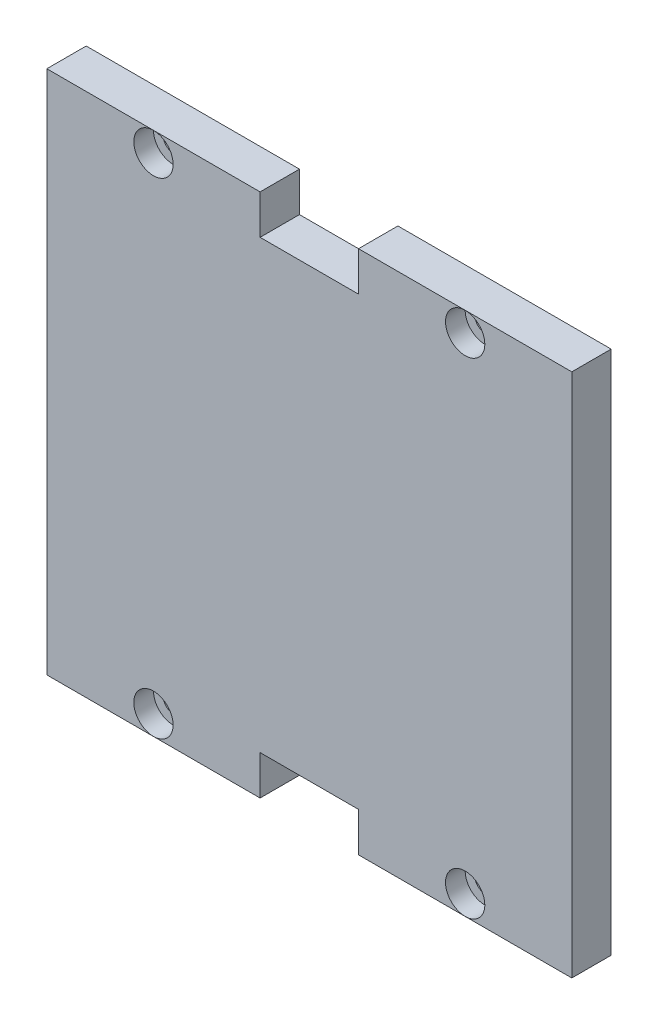
ISO-10303-21;
HEADER;
FILE_DESCRIPTION(('STEP AP214'),'2;1');
FILE_NAME('part.step','',(''),(''),'','','');
FILE_SCHEMA(('AUTOMOTIVE_DESIGN { 1 0 10303 214 1 1 1 1 }'));
ENDSEC;
DATA;
#1=APPLICATION_CONTEXT('core data for automotive mechanical design processes');
#2=APPLICATION_PROTOCOL_DEFINITION('international standard','automotive_design',2000,#1);
#3=PRODUCT_CONTEXT('',#1,'mechanical');
#4=PRODUCT('Part','Part','',(#3));
#5=PRODUCT_RELATED_PRODUCT_CATEGORY('part','',(#4));
#6=PRODUCT_DEFINITION_FORMATION('','',#4);
#7=PRODUCT_DEFINITION_CONTEXT('part definition',#1,'design');
#8=PRODUCT_DEFINITION('design','',#6,#7);
#9=PRODUCT_DEFINITION_SHAPE('','',#8);
#10=(LENGTH_UNIT() NAMED_UNIT(*) SI_UNIT(.MILLI.,.METRE.));
#11=(NAMED_UNIT(*) PLANE_ANGLE_UNIT() SI_UNIT($,.RADIAN.));
#12=(NAMED_UNIT(*) SI_UNIT($,.STERADIAN.) SOLID_ANGLE_UNIT());
#13=UNCERTAINTY_MEASURE_WITH_UNIT(LENGTH_MEASURE(1.E-05),#10,'distance_accuracy_value','');
#14=(GEOMETRIC_REPRESENTATION_CONTEXT(3) GLOBAL_UNCERTAINTY_ASSIGNED_CONTEXT((#13)) GLOBAL_UNIT_ASSIGNED_CONTEXT((#10,
#11,#12)) REPRESENTATION_CONTEXT('',''));
#15=CARTESIAN_POINT('',(0.,0.,0.));
#16=DIRECTION('',(0.,0.,1.));
#17=DIRECTION('',(1.,0.,0.));
#18=AXIS2_PLACEMENT_3D('',#15,#16,#17);
#19=CARTESIAN_POINT('',(-63.75,77.,0.));
#20=DIRECTION('',(0.,0.,1.));
#21=DIRECTION('',(1.,0.,0.));
#22=AXIS2_PLACEMENT_3D('',#19,#20,#21);
#23=CYLINDRICAL_SURFACE('',#22,1.5);
#24=CARTESIAN_POINT('',(-63.75,77.,0.));
#25=DIRECTION('',(0.,0.,1.));
#26=DIRECTION('',(-1.,0.,0.));
#27=AXIS2_PLACEMENT_3D('',#24,#25,#26);
#28=CIRCLE('',#27,1.5);
#29=CARTESIAN_POINT('',(-65.25,77.,0.));
#30=VERTEX_POINT('',#29);
#31=EDGE_CURVE('E259',#30,#30,#28,.T.);
#32=ORIENTED_EDGE('',*,*,#31,.F.);
#33=EDGE_LOOP('',(#32));
#34=FACE_BOUND('',#33,.T.);
#35=CARTESIAN_POINT('',(-63.75,77.,3.));
#36=DIRECTION('',(0.,0.,1.));
#37=DIRECTION('',(1.,0.,0.));
#38=AXIS2_PLACEMENT_3D('',#35,#36,#37);
#39=CIRCLE('',#38,1.5);
#40=CARTESIAN_POINT('',(-62.25,77.,3.));
#41=VERTEX_POINT('',#40);
#42=EDGE_CURVE('E39',#41,#41,#39,.F.);
#43=ORIENTED_EDGE('',*,*,#42,.F.);
#44=EDGE_LOOP('',(#43));
#45=FACE_BOUND('',#44,.T.);
#46=ADVANCED_FACE('F35',(#34,#45),#23,.F.);
#47=CARTESIAN_POINT('',(-16.25,77.,0.));
#48=DIRECTION('',(0.,0.,1.));
#49=DIRECTION('',(1.,0.,0.));
#50=AXIS2_PLACEMENT_3D('',#47,#48,#49);
#51=CYLINDRICAL_SURFACE('',#50,1.50000000000001);
#52=CARTESIAN_POINT('',(-16.25,77.,0.));
#53=DIRECTION('',(0.,0.,1.));
#54=DIRECTION('',(-1.,0.,0.));
#55=AXIS2_PLACEMENT_3D('',#52,#53,#54);
#56=CIRCLE('',#55,1.50000000000001);
#57=CARTESIAN_POINT('',(-17.75,77.,0.));
#58=VERTEX_POINT('',#57);
#59=EDGE_CURVE('E224',#58,#58,#56,.T.);
#60=ORIENTED_EDGE('',*,*,#59,.F.);
#61=EDGE_LOOP('',(#60));
#62=FACE_BOUND('',#61,.T.);
#63=CARTESIAN_POINT('',(-16.25,77.,3.));
#64=DIRECTION('',(0.,0.,1.));
#65=DIRECTION('',(1.,0.,0.));
#66=AXIS2_PLACEMENT_3D('',#63,#64,#65);
#67=CIRCLE('',#66,1.50000000000001);
#68=CARTESIAN_POINT('',(-14.75,77.,3.));
#69=VERTEX_POINT('',#68);
#70=EDGE_CURVE('E230',#69,#69,#67,.F.);
#71=ORIENTED_EDGE('',*,*,#70,.F.);
#72=EDGE_LOOP('',(#71));
#73=FACE_BOUND('',#72,.T.);
#74=ADVANCED_FACE('F292',(#62,#73),#51,.F.);
#75=CARTESIAN_POINT('',(-63.75,2.99999999999999,0.));
#76=DIRECTION('',(0.,0.,1.));
#77=DIRECTION('',(1.,0.,0.));
#78=AXIS2_PLACEMENT_3D('',#75,#76,#77);
#79=CYLINDRICAL_SURFACE('',#78,1.5);
#80=CARTESIAN_POINT('',(-63.75,2.99999999999999,0.));
#81=DIRECTION('',(0.,0.,1.));
#82=DIRECTION('',(1.,0.,0.));
#83=AXIS2_PLACEMENT_3D('',#80,#81,#82);
#84=CIRCLE('',#83,1.5);
#85=CARTESIAN_POINT('',(-62.25,2.99999999999999,0.));
#86=VERTEX_POINT('',#85);
#87=EDGE_CURVE('E257',#86,#86,#84,.T.);
#88=ORIENTED_EDGE('',*,*,#87,.F.);
#89=EDGE_LOOP('',(#88));
#90=FACE_BOUND('',#89,.T.);
#91=CARTESIAN_POINT('',(-63.75,2.99999999999999,3.));
#92=DIRECTION('',(0.,0.,1.));
#93=DIRECTION('',(1.,0.,0.));
#94=AXIS2_PLACEMENT_3D('',#91,#92,#93);
#95=CIRCLE('',#94,1.5);
#96=CARTESIAN_POINT('',(-62.25,2.99999999999999,3.));
#97=VERTEX_POINT('',#96);
#98=EDGE_CURVE('E226',#97,#97,#95,.F.);
#99=ORIENTED_EDGE('',*,*,#98,.F.);
#100=EDGE_LOOP('',(#99));
#101=FACE_BOUND('',#100,.T.);
#102=ADVANCED_FACE('F271',(#90,#101),#79,.F.);
#103=CARTESIAN_POINT('',(-16.25,2.99999999999998,0.));
#104=DIRECTION('',(0.,0.,1.));
#105=DIRECTION('',(1.,0.,0.));
#106=AXIS2_PLACEMENT_3D('',#103,#104,#105);
#107=CYLINDRICAL_SURFACE('',#106,1.5);
#108=CARTESIAN_POINT('',(-16.25,2.99999999999998,0.));
#109=DIRECTION('',(0.,0.,1.));
#110=DIRECTION('',(1.,0.,0.));
#111=AXIS2_PLACEMENT_3D('',#108,#109,#110);
#112=CIRCLE('',#111,1.5);
#113=CARTESIAN_POINT('',(-14.75,2.99999999999998,0.));
#114=VERTEX_POINT('',#113);
#115=EDGE_CURVE('E152',#114,#114,#112,.T.);
#116=ORIENTED_EDGE('',*,*,#115,.F.);
#117=EDGE_LOOP('',(#116));
#118=FACE_BOUND('',#117,.T.);
#119=CARTESIAN_POINT('',(-16.25,2.99999999999998,3.));
#120=DIRECTION('',(0.,0.,1.));
#121=DIRECTION('',(1.,0.,0.));
#122=AXIS2_PLACEMENT_3D('',#119,#120,#121);
#123=CIRCLE('',#122,1.5);
#124=CARTESIAN_POINT('',(-14.75,2.99999999999998,3.));
#125=VERTEX_POINT('',#124);
#126=EDGE_CURVE('E221',#125,#125,#123,.F.);
#127=ORIENTED_EDGE('',*,*,#126,.F.);
#128=EDGE_LOOP('',(#127));
#129=FACE_BOUND('',#128,.T.);
#130=ADVANCED_FACE('F267',(#118,#129),#107,.F.);
#131=CARTESIAN_POINT('',(0.,80.,6.));
#132=DIRECTION('',(0.,-1.,0.));
#133=DIRECTION('',(1.,0.,0.));
#134=AXIS2_PLACEMENT_3D('',#131,#132,#133);
#135=PLANE('',#134);
#136=DIRECTION('',(-1.,0.,0.));
#137=VECTOR('',#136,1.);
#138=CARTESIAN_POINT('',(0.,80.,6.));
#139=LINE('',#138,#137);
#140=CARTESIAN_POINT('',(-47.5,80.,6.));
#141=VERTEX_POINT('',#140);
#142=CARTESIAN_POINT('',(-80.,80.,6.));
#143=VERTEX_POINT('',#142);
#144=EDGE_CURVE('E192',#141,#143,#139,.T.);
#145=ORIENTED_EDGE('',*,*,#144,.F.);
#146=DIRECTION('',(0.,0.,1.));
#147=VECTOR('',#146,1.);
#148=CARTESIAN_POINT('',(-47.5,80.,0.));
#149=LINE('',#148,#147);
#150=CARTESIAN_POINT('',(-47.5,80.,0.));
#151=VERTEX_POINT('',#150);
#152=EDGE_CURVE('E158',#151,#141,#149,.T.);
#153=ORIENTED_EDGE('',*,*,#152,.F.);
#154=DIRECTION('',(-1.,0.,0.));
#155=VECTOR('',#154,1.);
#156=CARTESIAN_POINT('',(0.,80.,0.));
#157=LINE('',#156,#155);
#158=CARTESIAN_POINT('',(-80.,80.,0.));
#159=VERTEX_POINT('',#158);
#160=EDGE_CURVE('E146',#151,#159,#157,.T.);
#161=ORIENTED_EDGE('',*,*,#160,.T.);
#162=DIRECTION('',(0.,0.,-1.));
#163=VECTOR('',#162,1.);
#164=CARTESIAN_POINT('',(-80.,80.,6.));
#165=LINE('',#164,#163);
#166=EDGE_CURVE('E44',#143,#159,#165,.T.);
#167=ORIENTED_EDGE('',*,*,#166,.F.);
#168=EDGE_LOOP('',(#145,#153,#161,#167));
#169=FACE_BOUND('',#168,.T.);
#170=ADVANCED_FACE('F270',(#169),#135,.F.);
#171=CARTESIAN_POINT('',(0.,0.,6.));
#172=DIRECTION('',(0.,1.,0.));
#173=DIRECTION('',(-1.,0.,0.));
#174=AXIS2_PLACEMENT_3D('',#171,#172,#173);
#175=PLANE('',#174);
#176=DIRECTION('',(1.,0.,0.));
#177=VECTOR('',#176,1.);
#178=CARTESIAN_POINT('',(0.,0.,0.));
#179=LINE('',#178,#177);
#180=CARTESIAN_POINT('',(-80.,0.,0.));
#181=VERTEX_POINT('',#180);
#182=CARTESIAN_POINT('',(-47.5,0.,0.));
#183=VERTEX_POINT('',#182);
#184=EDGE_CURVE('E193',#181,#183,#179,.T.);
#185=ORIENTED_EDGE('',*,*,#184,.T.);
#186=DIRECTION('',(0.,0.,1.));
#187=VECTOR('',#186,1.);
#188=CARTESIAN_POINT('',(-47.5,0.,0.));
#189=LINE('',#188,#187);
#190=CARTESIAN_POINT('',(-47.5,0.,6.));
#191=VERTEX_POINT('',#190);
#192=EDGE_CURVE('E173',#183,#191,#189,.T.);
#193=ORIENTED_EDGE('',*,*,#192,.T.);
#194=DIRECTION('',(1.,0.,0.));
#195=VECTOR('',#194,1.);
#196=CARTESIAN_POINT('',(0.,0.,6.));
#197=LINE('',#196,#195);
#198=CARTESIAN_POINT('',(-80.,0.,6.));
#199=VERTEX_POINT('',#198);
#200=EDGE_CURVE('E200',#199,#191,#197,.T.);
#201=ORIENTED_EDGE('',*,*,#200,.F.);
#202=DIRECTION('',(0.,0.,-1.));
#203=VECTOR('',#202,1.);
#204=CARTESIAN_POINT('',(-80.,0.,6.));
#205=LINE('',#204,#203);
#206=EDGE_CURVE('E216',#199,#181,#205,.T.);
#207=ORIENTED_EDGE('',*,*,#206,.T.);
#208=EDGE_LOOP('',(#185,#193,#201,#207));
#209=FACE_BOUND('',#208,.T.);
#210=ADVANCED_FACE('F331',(#209),#175,.F.);
#211=CARTESIAN_POINT('',(0.,0.,6.));
#212=DIRECTION('',(-1.,0.,0.));
#213=DIRECTION('',(0.,0.,1.));
#214=AXIS2_PLACEMENT_3D('',#211,#212,#213);
#215=PLANE('',#214);
#216=DIRECTION('',(0.,1.,0.));
#217=VECTOR('',#216,1.);
#218=CARTESIAN_POINT('',(0.,0.,0.));
#219=LINE('',#218,#217);
#220=CARTESIAN_POINT('',(0.,0.,0.));
#221=VERTEX_POINT('',#220);
#222=CARTESIAN_POINT('',(0.,80.,0.));
#223=VERTEX_POINT('',#222);
#224=EDGE_CURVE('E182',#221,#223,#219,.T.);
#225=ORIENTED_EDGE('',*,*,#224,.T.);
#226=DIRECTION('',(0.,0.,-1.));
#227=VECTOR('',#226,1.);
#228=CARTESIAN_POINT('',(0.,80.,6.));
#229=LINE('',#228,#227);
#230=CARTESIAN_POINT('',(0.,80.,6.));
#231=VERTEX_POINT('',#230);
#232=EDGE_CURVE('E11',#231,#223,#229,.T.);
#233=ORIENTED_EDGE('',*,*,#232,.F.);
#234=DIRECTION('',(0.,1.,0.));
#235=VECTOR('',#234,1.);
#236=CARTESIAN_POINT('',(0.,0.,6.));
#237=LINE('',#236,#235);
#238=CARTESIAN_POINT('',(0.,0.,6.));
#239=VERTEX_POINT('',#238);
#240=EDGE_CURVE('E189',#239,#231,#237,.T.);
#241=ORIENTED_EDGE('',*,*,#240,.F.);
#242=DIRECTION('',(0.,0.,-1.));
#243=VECTOR('',#242,1.);
#244=CARTESIAN_POINT('',(0.,0.,6.));
#245=LINE('',#244,#243);
#246=EDGE_CURVE('E203',#239,#221,#245,.T.);
#247=ORIENTED_EDGE('',*,*,#246,.T.);
#248=EDGE_LOOP('',(#225,#233,#241,#247));
#249=FACE_BOUND('',#248,.T.);
#250=ADVANCED_FACE('F37',(#249),#215,.F.);
#251=CARTESIAN_POINT('',(-32.5,80.,0.));
#252=VERTEX_POINT('',#251);
#253=EDGE_CURVE('E206',#223,#252,#157,.T.);
#254=ORIENTED_EDGE('',*,*,#253,.T.);
#255=DIRECTION('',(0.,0.,1.));
#256=VECTOR('',#255,1.);
#257=CARTESIAN_POINT('',(-32.5,80.,0.));
#258=LINE('',#257,#256);
#259=CARTESIAN_POINT('',(-32.5,80.,6.));
#260=VERTEX_POINT('',#259);
#261=EDGE_CURVE('E161',#252,#260,#258,.T.);
#262=ORIENTED_EDGE('',*,*,#261,.T.);
#263=EDGE_CURVE('E194',#231,#260,#139,.T.);
#264=ORIENTED_EDGE('',*,*,#263,.F.);
#265=ORIENTED_EDGE('',*,*,#232,.T.);
#266=EDGE_LOOP('',(#254,#262,#264,#265));
#267=FACE_BOUND('',#266,.T.);
#268=ADVANCED_FACE('F333',(#267),#135,.F.);
#269=CARTESIAN_POINT('',(-80.,0.,6.));
#270=DIRECTION('',(1.,0.,0.));
#271=DIRECTION('',(0.,0.,-1.));
#272=AXIS2_PLACEMENT_3D('',#269,#270,#271);
#273=PLANE('',#272);
#274=DIRECTION('',(0.,-1.,0.));
#275=VECTOR('',#274,1.);
#276=CARTESIAN_POINT('',(-80.,0.,0.));
#277=LINE('',#276,#275);
#278=EDGE_CURVE('E209',#159,#181,#277,.T.);
#279=ORIENTED_EDGE('',*,*,#278,.T.);
#280=ORIENTED_EDGE('',*,*,#206,.F.);
#281=DIRECTION('',(0.,-1.,0.));
#282=VECTOR('',#281,1.);
#283=CARTESIAN_POINT('',(-80.,0.,6.));
#284=LINE('',#283,#282);
#285=EDGE_CURVE('E197',#143,#199,#284,.T.);
#286=ORIENTED_EDGE('',*,*,#285,.F.);
#287=ORIENTED_EDGE('',*,*,#166,.T.);
#288=EDGE_LOOP('',(#279,#280,#286,#287));
#289=FACE_BOUND('',#288,.T.);
#290=ADVANCED_FACE('F329',(#289),#273,.F.);
#291=CARTESIAN_POINT('',(-32.5,0.,6.));
#292=VERTEX_POINT('',#291);
#293=EDGE_CURVE('E199',#292,#239,#197,.T.);
#294=ORIENTED_EDGE('',*,*,#293,.F.);
#295=DIRECTION('',(0.,0.,1.));
#296=VECTOR('',#295,1.);
#297=CARTESIAN_POINT('',(-32.5,0.,0.));
#298=LINE('',#297,#296);
#299=CARTESIAN_POINT('',(-32.5,0.,0.));
#300=VERTEX_POINT('',#299);
#301=EDGE_CURVE('E185',#300,#292,#298,.T.);
#302=ORIENTED_EDGE('',*,*,#301,.F.);
#303=EDGE_CURVE('E211',#300,#221,#179,.T.);
#304=ORIENTED_EDGE('',*,*,#303,.T.);
#305=ORIENTED_EDGE('',*,*,#246,.F.);
#306=EDGE_LOOP('',(#294,#302,#304,#305));
#307=FACE_BOUND('',#306,.T.);
#308=ADVANCED_FACE('F322',(#307),#175,.F.);
#309=CARTESIAN_POINT('',(0.,0.,6.));
#310=DIRECTION('',(0.,0.,1.));
#311=DIRECTION('',(1.,0.,0.));
#312=AXIS2_PLACEMENT_3D('',#309,#310,#311);
#313=PLANE('',#312);
#314=CARTESIAN_POINT('',(-63.75,77.,6.));
#315=DIRECTION('',(0.,0.,1.));
#316=DIRECTION('',(1.,0.,0.));
#317=AXIS2_PLACEMENT_3D('',#314,#315,#316);
#318=CIRCLE('',#317,2.99499999999999);
#319=CARTESIAN_POINT('',(-60.755,77.,6.));
#320=VERTEX_POINT('',#319);
#321=EDGE_CURVE('E246',#320,#320,#318,.T.);
#322=ORIENTED_EDGE('',*,*,#321,.F.);
#323=EDGE_LOOP('',(#322));
#324=FACE_BOUND('',#323,.T.);
#325=CARTESIAN_POINT('',(-16.25,77.,6.));
#326=DIRECTION('',(0.,0.,1.));
#327=DIRECTION('',(1.,0.,0.));
#328=AXIS2_PLACEMENT_3D('',#325,#326,#327);
#329=CIRCLE('',#328,2.995);
#330=CARTESIAN_POINT('',(-13.255,77.,6.));
#331=VERTEX_POINT('',#330);
#332=EDGE_CURVE('E239',#331,#331,#329,.T.);
#333=ORIENTED_EDGE('',*,*,#332,.F.);
#334=EDGE_LOOP('',(#333));
#335=FACE_BOUND('',#334,.T.);
#336=CARTESIAN_POINT('',(-63.75,2.99999999999999,6.));
#337=DIRECTION('',(0.,0.,1.));
#338=DIRECTION('',(1.,0.,0.));
#339=AXIS2_PLACEMENT_3D('',#336,#337,#338);
#340=CIRCLE('',#339,2.995);
#341=CARTESIAN_POINT('',(-60.755,2.99999999999999,6.));
#342=VERTEX_POINT('',#341);
#343=EDGE_CURVE('E232',#342,#342,#340,.T.);
#344=ORIENTED_EDGE('',*,*,#343,.F.);
#345=EDGE_LOOP('',(#344));
#346=FACE_BOUND('',#345,.T.);
#347=CARTESIAN_POINT('',(-16.25,2.99999999999998,6.));
#348=DIRECTION('',(0.,0.,1.));
#349=DIRECTION('',(1.,0.,0.));
#350=AXIS2_PLACEMENT_3D('',#347,#348,#349);
#351=CIRCLE('',#350,2.995);
#352=CARTESIAN_POINT('',(-13.255,2.99999999999998,6.));
#353=VERTEX_POINT('',#352);
#354=EDGE_CURVE('E228',#353,#353,#351,.T.);
#355=ORIENTED_EDGE('',*,*,#354,.F.);
#356=EDGE_LOOP('',(#355));
#357=FACE_BOUND('',#356,.T.);
#358=DIRECTION('',(0.,-1.,0.));
#359=VECTOR('',#358,1.);
#360=CARTESIAN_POINT('',(-47.5,80.,6.));
#361=LINE('',#360,#359);
#362=CARTESIAN_POINT('',(-47.5,74.,6.));
#363=VERTEX_POINT('',#362);
#364=EDGE_CURVE('E132',#141,#363,#361,.T.);
#365=ORIENTED_EDGE('',*,*,#364,.F.);
#366=ORIENTED_EDGE('',*,*,#144,.T.);
#367=ORIENTED_EDGE('',*,*,#285,.T.);
#368=ORIENTED_EDGE('',*,*,#200,.T.);
#369=DIRECTION('',(0.,-1.,0.));
#370=VECTOR('',#369,1.);
#371=CARTESIAN_POINT('',(-47.5,0.,6.));
#372=LINE('',#371,#370);
#373=CARTESIAN_POINT('',(-47.5,5.99999999999998,6.));
#374=VERTEX_POINT('',#373);
#375=EDGE_CURVE('E160',#374,#191,#372,.T.);
#376=ORIENTED_EDGE('',*,*,#375,.F.);
#377=DIRECTION('',(-1.,0.,0.));
#378=VECTOR('',#377,1.);
#379=CARTESIAN_POINT('',(-47.5,5.99999999999998,6.));
#380=LINE('',#379,#378);
#381=CARTESIAN_POINT('',(-32.5,5.99999999999998,6.));
#382=VERTEX_POINT('',#381);
#383=EDGE_CURVE('E169',#382,#374,#380,.T.);
#384=ORIENTED_EDGE('',*,*,#383,.F.);
#385=DIRECTION('',(0.,1.,0.));
#386=VECTOR('',#385,1.);
#387=CARTESIAN_POINT('',(-32.5,0.,6.));
#388=LINE('',#387,#386);
#389=EDGE_CURVE('E175',#292,#382,#388,.T.);
#390=ORIENTED_EDGE('',*,*,#389,.F.);
#391=ORIENTED_EDGE('',*,*,#293,.T.);
#392=ORIENTED_EDGE('',*,*,#240,.T.);
#393=ORIENTED_EDGE('',*,*,#263,.T.);
#394=DIRECTION('',(0.,1.,0.));
#395=VECTOR('',#394,1.);
#396=CARTESIAN_POINT('',(-32.5,80.,6.));
#397=LINE('',#396,#395);
#398=CARTESIAN_POINT('',(-32.5,74.,6.));
#399=VERTEX_POINT('',#398);
#400=EDGE_CURVE('E147',#399,#260,#397,.T.);
#401=ORIENTED_EDGE('',*,*,#400,.F.);
#402=DIRECTION('',(1.,0.,0.));
#403=VECTOR('',#402,1.);
#404=CARTESIAN_POINT('',(-47.5,74.,6.));
#405=LINE('',#404,#403);
#406=EDGE_CURVE('E149',#363,#399,#405,.T.);
#407=ORIENTED_EDGE('',*,*,#406,.F.);
#408=EDGE_LOOP('',(#365,#366,#367,#368,#376,#384,#390,#391,#392,#393,#401,#407));
#409=FACE_BOUND('',#408,.T.);
#410=ADVANCED_FACE('F319',(#324,#335,#346,#357,#409),#313,.T.);
#411=CARTESIAN_POINT('',(0.,0.,0.));
#412=DIRECTION('',(0.,0.,1.));
#413=DIRECTION('',(1.,0.,0.));
#414=AXIS2_PLACEMENT_3D('',#411,#412,#413);
#415=PLANE('',#414);
#416=ORIENTED_EDGE('',*,*,#59,.T.);
#417=EDGE_LOOP('',(#416));
#418=FACE_BOUND('',#417,.T.);
#419=ORIENTED_EDGE('',*,*,#87,.T.);
#420=EDGE_LOOP('',(#419));
#421=FACE_BOUND('',#420,.T.);
#422=ORIENTED_EDGE('',*,*,#31,.T.);
#423=EDGE_LOOP('',(#422));
#424=FACE_BOUND('',#423,.T.);
#425=ORIENTED_EDGE('',*,*,#115,.T.);
#426=EDGE_LOOP('',(#425));
#427=FACE_BOUND('',#426,.T.);
#428=ORIENTED_EDGE('',*,*,#160,.F.);
#429=DIRECTION('',(0.,-1.,0.));
#430=VECTOR('',#429,1.);
#431=CARTESIAN_POINT('',(-47.5,80.,0.));
#432=LINE('',#431,#430);
#433=CARTESIAN_POINT('',(-47.5,74.,0.));
#434=VERTEX_POINT('',#433);
#435=EDGE_CURVE('E129',#151,#434,#432,.T.);
#436=ORIENTED_EDGE('',*,*,#435,.T.);
#437=DIRECTION('',(1.,0.,0.));
#438=VECTOR('',#437,1.);
#439=CARTESIAN_POINT('',(-47.5,74.,0.));
#440=LINE('',#439,#438);
#441=CARTESIAN_POINT('',(-32.5,74.,0.));
#442=VERTEX_POINT('',#441);
#443=EDGE_CURVE('E139',#434,#442,#440,.T.);
#444=ORIENTED_EDGE('',*,*,#443,.T.);
#445=DIRECTION('',(0.,1.,0.));
#446=VECTOR('',#445,1.);
#447=CARTESIAN_POINT('',(-32.5,80.,0.));
#448=LINE('',#447,#446);
#449=EDGE_CURVE('E52',#442,#252,#448,.T.);
#450=ORIENTED_EDGE('',*,*,#449,.T.);
#451=ORIENTED_EDGE('',*,*,#253,.F.);
#452=ORIENTED_EDGE('',*,*,#224,.F.);
#453=ORIENTED_EDGE('',*,*,#303,.F.);
#454=DIRECTION('',(0.,1.,0.));
#455=VECTOR('',#454,1.);
#456=CARTESIAN_POINT('',(-32.5,0.,0.));
#457=LINE('',#456,#455);
#458=CARTESIAN_POINT('',(-32.5,5.99999999999998,0.));
#459=VERTEX_POINT('',#458);
#460=EDGE_CURVE('E168',#300,#459,#457,.T.);
#461=ORIENTED_EDGE('',*,*,#460,.T.);
#462=DIRECTION('',(-1.,0.,0.));
#463=VECTOR('',#462,1.);
#464=CARTESIAN_POINT('',(-47.5,5.99999999999998,0.));
#465=LINE('',#464,#463);
#466=CARTESIAN_POINT('',(-47.5,5.99999999999998,0.));
#467=VERTEX_POINT('',#466);
#468=EDGE_CURVE('E60',#459,#467,#465,.T.);
#469=ORIENTED_EDGE('',*,*,#468,.T.);
#470=DIRECTION('',(0.,-1.,0.));
#471=VECTOR('',#470,1.);
#472=CARTESIAN_POINT('',(-47.5,0.,0.));
#473=LINE('',#472,#471);
#474=EDGE_CURVE('E165',#467,#183,#473,.T.);
#475=ORIENTED_EDGE('',*,*,#474,.T.);
#476=ORIENTED_EDGE('',*,*,#184,.F.);
#477=ORIENTED_EDGE('',*,*,#278,.F.);
#478=EDGE_LOOP('',(#428,#436,#444,#450,#451,#452,#453,#461,#469,#475,#476,#477));
#479=FACE_BOUND('',#478,.T.);
#480=ADVANCED_FACE('F144',(#418,#421,#424,#427,#479),#415,.F.);
#481=CARTESIAN_POINT('',(-47.5,0.,0.));
#482=DIRECTION('',(-1.,0.,0.));
#483=DIRECTION('',(0.,-1.,0.));
#484=AXIS2_PLACEMENT_3D('',#481,#482,#483);
#485=PLANE('',#484);
#486=ORIENTED_EDGE('',*,*,#375,.T.);
#487=ORIENTED_EDGE('',*,*,#192,.F.);
#488=ORIENTED_EDGE('',*,*,#474,.F.);
#489=DIRECTION('',(0.,0.,1.));
#490=VECTOR('',#489,1.);
#491=CARTESIAN_POINT('',(-47.5,5.99999999999998,0.));
#492=LINE('',#491,#490);
#493=EDGE_CURVE('E180',#467,#374,#492,.T.);
#494=ORIENTED_EDGE('',*,*,#493,.T.);
#495=EDGE_LOOP('',(#486,#487,#488,#494));
#496=FACE_BOUND('',#495,.T.);
#497=ADVANCED_FACE('F312',(#496),#485,.F.);
#498=CARTESIAN_POINT('',(-47.5,5.99999999999998,0.));
#499=DIRECTION('',(0.,1.,0.));
#500=DIRECTION('',(0.,0.,1.));
#501=AXIS2_PLACEMENT_3D('',#498,#499,#500);
#502=PLANE('',#501);
#503=ORIENTED_EDGE('',*,*,#383,.T.);
#504=ORIENTED_EDGE('',*,*,#493,.F.);
#505=ORIENTED_EDGE('',*,*,#468,.F.);
#506=DIRECTION('',(0.,0.,1.));
#507=VECTOR('',#506,1.);
#508=CARTESIAN_POINT('',(-32.5,5.99999999999998,0.));
#509=LINE('',#508,#507);
#510=EDGE_CURVE('E183',#459,#382,#509,.T.);
#511=ORIENTED_EDGE('',*,*,#510,.T.);
#512=EDGE_LOOP('',(#503,#504,#505,#511));
#513=FACE_BOUND('',#512,.T.);
#514=ADVANCED_FACE('F309',(#513),#502,.F.);
#515=CARTESIAN_POINT('',(-32.5,0.,0.));
#516=DIRECTION('',(1.,0.,0.));
#517=DIRECTION('',(0.,0.,-1.));
#518=AXIS2_PLACEMENT_3D('',#515,#516,#517);
#519=PLANE('',#518);
#520=ORIENTED_EDGE('',*,*,#389,.T.);
#521=ORIENTED_EDGE('',*,*,#510,.F.);
#522=ORIENTED_EDGE('',*,*,#460,.F.);
#523=ORIENTED_EDGE('',*,*,#301,.T.);
#524=EDGE_LOOP('',(#520,#521,#522,#523));
#525=FACE_BOUND('',#524,.T.);
#526=ADVANCED_FACE('F308',(#525),#519,.F.);
#527=CARTESIAN_POINT('',(-47.5,80.,0.));
#528=DIRECTION('',(-1.,0.,0.));
#529=DIRECTION('',(0.,-1.,0.));
#530=AXIS2_PLACEMENT_3D('',#527,#528,#529);
#531=PLANE('',#530);
#532=ORIENTED_EDGE('',*,*,#364,.T.);
#533=DIRECTION('',(0.,0.,1.));
#534=VECTOR('',#533,1.);
#535=CARTESIAN_POINT('',(-47.5,74.,0.));
#536=LINE('',#535,#534);
#537=EDGE_CURVE('E125',#434,#363,#536,.T.);
#538=ORIENTED_EDGE('',*,*,#537,.F.);
#539=ORIENTED_EDGE('',*,*,#435,.F.);
#540=ORIENTED_EDGE('',*,*,#152,.T.);
#541=EDGE_LOOP('',(#532,#538,#539,#540));
#542=FACE_BOUND('',#541,.T.);
#543=ADVANCED_FACE('F127',(#542),#531,.F.);
#544=CARTESIAN_POINT('',(-32.5,80.,0.));
#545=DIRECTION('',(1.,0.,0.));
#546=DIRECTION('',(0.,0.,-1.));
#547=AXIS2_PLACEMENT_3D('',#544,#545,#546);
#548=PLANE('',#547);
#549=ORIENTED_EDGE('',*,*,#400,.T.);
#550=ORIENTED_EDGE('',*,*,#261,.F.);
#551=ORIENTED_EDGE('',*,*,#449,.F.);
#552=DIRECTION('',(0.,0.,1.));
#553=VECTOR('',#552,1.);
#554=CARTESIAN_POINT('',(-32.5,74.,0.));
#555=LINE('',#554,#553);
#556=EDGE_CURVE('E136',#442,#399,#555,.T.);
#557=ORIENTED_EDGE('',*,*,#556,.T.);
#558=EDGE_LOOP('',(#549,#550,#551,#557));
#559=FACE_BOUND('',#558,.T.);
#560=ADVANCED_FACE('F288',(#559),#548,.F.);
#561=CARTESIAN_POINT('',(-47.5,74.,0.));
#562=DIRECTION('',(0.,-1.,0.));
#563=DIRECTION('',(0.,0.,-1.));
#564=AXIS2_PLACEMENT_3D('',#561,#562,#563);
#565=PLANE('',#564);
#566=ORIENTED_EDGE('',*,*,#406,.T.);
#567=ORIENTED_EDGE('',*,*,#556,.F.);
#568=ORIENTED_EDGE('',*,*,#443,.F.);
#569=ORIENTED_EDGE('',*,*,#537,.T.);
#570=EDGE_LOOP('',(#566,#567,#568,#569));
#571=FACE_BOUND('',#570,.T.);
#572=ADVANCED_FACE('F140',(#571),#565,.F.);
#573=CARTESIAN_POINT('',(-16.25,2.99999999999998,3.));
#574=DIRECTION('',(0.,0.,1.));
#575=DIRECTION('',(1.,0.,0.));
#576=AXIS2_PLACEMENT_3D('',#573,#574,#575);
#577=PLANE('',#576);
#578=CARTESIAN_POINT('',(-16.25,2.99999999999998,3.));
#579=DIRECTION('',(0.,0.,1.));
#580=DIRECTION('',(1.,0.,0.));
#581=AXIS2_PLACEMENT_3D('',#578,#579,#580);
#582=CIRCLE('',#581,2.995);
#583=CARTESIAN_POINT('',(-13.255,2.99999999999998,3.));
#584=VERTEX_POINT('',#583);
#585=EDGE_CURVE('E225',#584,#584,#582,.T.);
#586=ORIENTED_EDGE('',*,*,#585,.T.);
#587=EDGE_LOOP('',(#586));
#588=FACE_BOUND('',#587,.T.);
#589=ORIENTED_EDGE('',*,*,#126,.T.);
#590=EDGE_LOOP('',(#589));
#591=FACE_BOUND('',#590,.T.);
#592=ADVANCED_FACE('F275',(#588,#591),#577,.T.);
#593=CARTESIAN_POINT('',(-16.25,2.99999999999998,3.));
#594=DIRECTION('',(0.,0.,1.));
#595=DIRECTION('',(1.,0.,0.));
#596=AXIS2_PLACEMENT_3D('',#593,#594,#595);
#597=CYLINDRICAL_SURFACE('',#596,2.995);
#598=ORIENTED_EDGE('',*,*,#585,.F.);
#599=EDGE_LOOP('',(#598));
#600=FACE_BOUND('',#599,.T.);
#601=ORIENTED_EDGE('',*,*,#354,.T.);
#602=EDGE_LOOP('',(#601));
#603=FACE_BOUND('',#602,.T.);
#604=ADVANCED_FACE('F277',(#600,#603),#597,.F.);
#605=CARTESIAN_POINT('',(-63.75,2.99999999999999,3.));
#606=DIRECTION('',(0.,0.,1.));
#607=DIRECTION('',(1.,0.,0.));
#608=AXIS2_PLACEMENT_3D('',#605,#606,#607);
#609=PLANE('',#608);
#610=CARTESIAN_POINT('',(-63.75,2.99999999999999,3.));
#611=DIRECTION('',(0.,0.,1.));
#612=DIRECTION('',(1.,0.,0.));
#613=AXIS2_PLACEMENT_3D('',#610,#611,#612);
#614=CIRCLE('',#613,2.995);
#615=CARTESIAN_POINT('',(-60.755,2.99999999999999,3.));
#616=VERTEX_POINT('',#615);
#617=EDGE_CURVE('E229',#616,#616,#614,.T.);
#618=ORIENTED_EDGE('',*,*,#617,.T.);
#619=EDGE_LOOP('',(#618));
#620=FACE_BOUND('',#619,.T.);
#621=ORIENTED_EDGE('',*,*,#98,.T.);
#622=EDGE_LOOP('',(#621));
#623=FACE_BOUND('',#622,.T.);
#624=ADVANCED_FACE('F284',(#620,#623),#609,.T.);
#625=CARTESIAN_POINT('',(-63.75,2.99999999999999,3.));
#626=DIRECTION('',(0.,0.,1.));
#627=DIRECTION('',(1.,0.,0.));
#628=AXIS2_PLACEMENT_3D('',#625,#626,#627);
#629=CYLINDRICAL_SURFACE('',#628,2.995);
#630=ORIENTED_EDGE('',*,*,#617,.F.);
#631=EDGE_LOOP('',(#630));
#632=FACE_BOUND('',#631,.T.);
#633=ORIENTED_EDGE('',*,*,#343,.T.);
#634=EDGE_LOOP('',(#633));
#635=FACE_BOUND('',#634,.T.);
#636=ADVANCED_FACE('F459',(#632,#635),#629,.F.);
#637=CARTESIAN_POINT('',(-16.25,77.,3.));
#638=DIRECTION('',(0.,0.,1.));
#639=DIRECTION('',(1.,0.,0.));
#640=AXIS2_PLACEMENT_3D('',#637,#638,#639);
#641=PLANE('',#640);
#642=CARTESIAN_POINT('',(-16.25,77.,3.));
#643=DIRECTION('',(0.,0.,1.));
#644=DIRECTION('',(1.,0.,0.));
#645=AXIS2_PLACEMENT_3D('',#642,#643,#644);
#646=CIRCLE('',#645,2.995);
#647=CARTESIAN_POINT('',(-13.255,77.,3.));
#648=VERTEX_POINT('',#647);
#649=EDGE_CURVE('E233',#648,#648,#646,.T.);
#650=ORIENTED_EDGE('',*,*,#649,.T.);
#651=EDGE_LOOP('',(#650));
#652=FACE_BOUND('',#651,.T.);
#653=ORIENTED_EDGE('',*,*,#70,.T.);
#654=EDGE_LOOP('',(#653));
#655=FACE_BOUND('',#654,.T.);
#656=ADVANCED_FACE('F468',(#652,#655),#641,.T.);
#657=CARTESIAN_POINT('',(-16.25,77.,3.));
#658=DIRECTION('',(0.,0.,1.));
#659=DIRECTION('',(1.,0.,0.));
#660=AXIS2_PLACEMENT_3D('',#657,#658,#659);
#661=CYLINDRICAL_SURFACE('',#660,2.995);
#662=ORIENTED_EDGE('',*,*,#649,.F.);
#663=EDGE_LOOP('',(#662));
#664=FACE_BOUND('',#663,.T.);
#665=ORIENTED_EDGE('',*,*,#332,.T.);
#666=EDGE_LOOP('',(#665));
#667=FACE_BOUND('',#666,.T.);
#668=ADVANCED_FACE('F476',(#664,#667),#661,.F.);
#669=CARTESIAN_POINT('',(-63.75,77.,3.));
#670=DIRECTION('',(0.,0.,1.));
#671=DIRECTION('',(1.,0.,0.));
#672=AXIS2_PLACEMENT_3D('',#669,#670,#671);
#673=PLANE('',#672);
#674=CARTESIAN_POINT('',(-63.75,77.,3.));
#675=DIRECTION('',(0.,0.,1.));
#676=DIRECTION('',(1.,0.,0.));
#677=AXIS2_PLACEMENT_3D('',#674,#675,#676);
#678=CIRCLE('',#677,2.99499999999999);
#679=CARTESIAN_POINT('',(-60.755,77.,3.));
#680=VERTEX_POINT('',#679);
#681=EDGE_CURVE('E514',#680,#680,#678,.T.);
#682=ORIENTED_EDGE('',*,*,#681,.T.);
#683=EDGE_LOOP('',(#682));
#684=FACE_BOUND('',#683,.T.);
#685=ORIENTED_EDGE('',*,*,#42,.T.);
#686=EDGE_LOOP('',(#685));
#687=FACE_BOUND('',#686,.T.);
#688=ADVANCED_FACE('F484',(#684,#687),#673,.T.);
#689=CARTESIAN_POINT('',(-63.75,77.,3.));
#690=DIRECTION('',(0.,0.,1.));
#691=DIRECTION('',(1.,0.,0.));
#692=AXIS2_PLACEMENT_3D('',#689,#690,#691);
#693=CYLINDRICAL_SURFACE('',#692,2.99499999999999);
#694=ORIENTED_EDGE('',*,*,#681,.F.);
#695=EDGE_LOOP('',(#694));
#696=FACE_BOUND('',#695,.T.);
#697=ORIENTED_EDGE('',*,*,#321,.T.);
#698=EDGE_LOOP('',(#697));
#699=FACE_BOUND('',#698,.T.);
#700=ADVANCED_FACE('F493',(#696,#699),#693,.F.);
#701=CLOSED_SHELL('',(#46,#74,#102,#130,#170,#210,#250,#268,#290,#308,#410,#480,#497,#514,#526,
#543,#560,#572,#592,#604,#624,#636,#656,#668,#688,#700));
#702=MANIFOLD_SOLID_BREP('B2',#701);
#703=ADVANCED_BREP_SHAPE_REPRESENTATION('',(#18,#702),#14);
#704=SHAPE_DEFINITION_REPRESENTATION(#9,#703);
ENDSEC;
END-ISO-10303-21;
